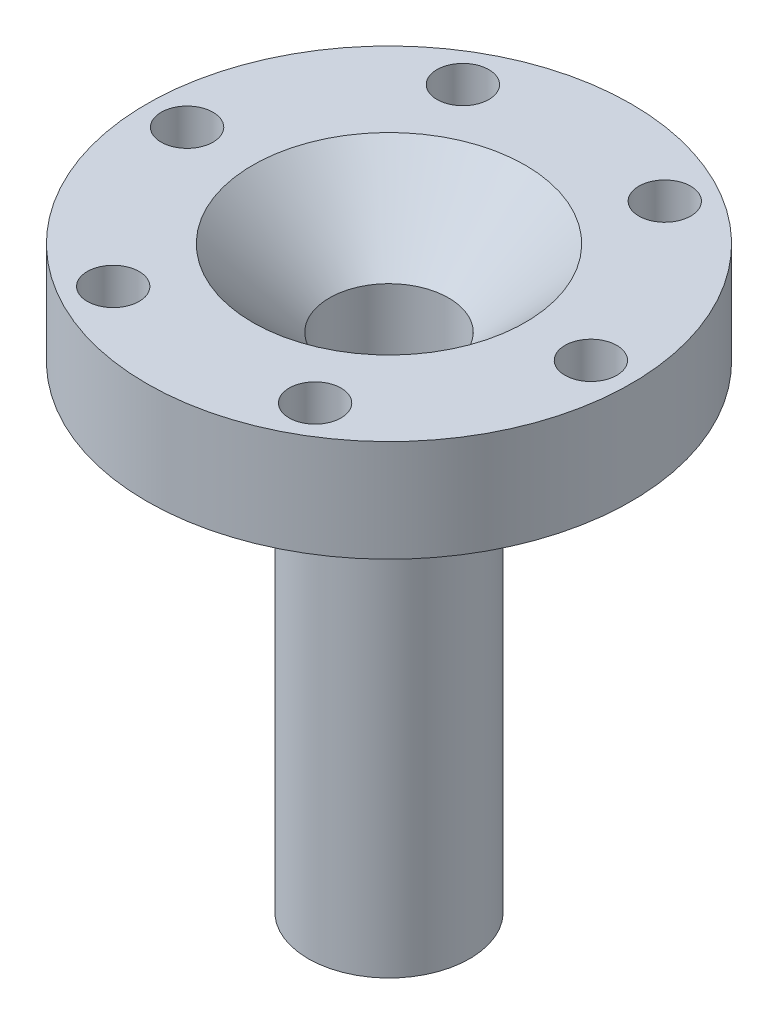
ISO-10303-21;
HEADER;
FILE_DESCRIPTION(('STEP AP214'),'2;1');
FILE_NAME('part.step','',(''),(''),'','','');
FILE_SCHEMA(('AUTOMOTIVE_DESIGN { 1 0 10303 214 1 1 1 1 }'));
ENDSEC;
DATA;
#1=APPLICATION_CONTEXT('core data for automotive mechanical design processes');
#2=APPLICATION_PROTOCOL_DEFINITION('international standard','automotive_design',2000,#1);
#3=PRODUCT_CONTEXT('',#1,'mechanical');
#4=PRODUCT('Part','Part','',(#3));
#5=PRODUCT_RELATED_PRODUCT_CATEGORY('part','',(#4));
#6=PRODUCT_DEFINITION_FORMATION('','',#4);
#7=PRODUCT_DEFINITION_CONTEXT('part definition',#1,'design');
#8=PRODUCT_DEFINITION('design','',#6,#7);
#9=PRODUCT_DEFINITION_SHAPE('','',#8);
#10=(LENGTH_UNIT() NAMED_UNIT(*) SI_UNIT(.MILLI.,.METRE.));
#11=(NAMED_UNIT(*) PLANE_ANGLE_UNIT() SI_UNIT($,.RADIAN.));
#12=(NAMED_UNIT(*) SI_UNIT($,.STERADIAN.) SOLID_ANGLE_UNIT());
#13=UNCERTAINTY_MEASURE_WITH_UNIT(LENGTH_MEASURE(1.E-05),#10,'distance_accuracy_value','');
#14=(GEOMETRIC_REPRESENTATION_CONTEXT(3) GLOBAL_UNCERTAINTY_ASSIGNED_CONTEXT((#13)) GLOBAL_UNIT_ASSIGNED_CONTEXT((#10,
#11,#12)) REPRESENTATION_CONTEXT('',''));
#15=CARTESIAN_POINT('',(0.,0.,0.));
#16=DIRECTION('',(0.,0.,1.));
#17=DIRECTION('',(1.,0.,0.));
#18=AXIS2_PLACEMENT_3D('',#15,#16,#17);
#19=CARTESIAN_POINT('',(10.16,-72.8200000000001,0.));
#20=DIRECTION('',(0.,1.,0.));
#21=DIRECTION('',(0.,0.,1.));
#22=AXIS2_PLACEMENT_3D('',#19,#20,#21);
#23=PLANE('',#22);
#24=CARTESIAN_POINT('',(0.,-72.8200000000001,0.));
#25=DIRECTION('',(0.,1.,0.));
#26=DIRECTION('',(0.,0.,1.));
#27=AXIS2_PLACEMENT_3D('',#24,#25,#26);
#28=CIRCLE('',#27,10.16);
#29=CARTESIAN_POINT('',(0.,-72.8200000000001,10.16));
#30=VERTEX_POINT('',#29);
#31=EDGE_CURVE('E49',#30,#30,#28,.T.);
#32=ORIENTED_EDGE('',*,*,#31,.F.);
#33=EDGE_LOOP('',(#32));
#34=FACE_BOUND('',#33,.T.);
#35=CARTESIAN_POINT('',(0.,-72.8200000000001,0.));
#36=DIRECTION('',(0.,1.,0.));
#37=DIRECTION('',(0.,0.,1.));
#38=AXIS2_PLACEMENT_3D('',#35,#36,#37);
#39=CIRCLE('',#38,7.50000000000001);
#40=CARTESIAN_POINT('',(0.,-72.8200000000001,7.50000000000001));
#41=VERTEX_POINT('',#40);
#42=EDGE_CURVE('E10',#41,#41,#39,.T.);
#43=ORIENTED_EDGE('',*,*,#42,.T.);
#44=EDGE_LOOP('',(#43));
#45=FACE_BOUND('',#44,.T.);
#46=ADVANCED_FACE('F32',(#34,#45),#23,.F.);
#47=CARTESIAN_POINT('',(0.,0.,0.));
#48=DIRECTION('',(0.,1.,0.));
#49=DIRECTION('',(0.,0.,1.));
#50=AXIS2_PLACEMENT_3D('',#47,#48,#49);
#51=CYLINDRICAL_SURFACE('',#50,7.50000000000001);
#52=ORIENTED_EDGE('',*,*,#42,.F.);
#53=EDGE_LOOP('',(#52));
#54=FACE_BOUND('',#53,.T.);
#55=CARTESIAN_POINT('',(0.,-9.6450000000001,0.));
#56=DIRECTION('',(0.,1.,0.));
#57=DIRECTION('',(0.,0.,1.));
#58=AXIS2_PLACEMENT_3D('',#55,#56,#57);
#59=CIRCLE('',#58,7.50000000000001);
#60=CARTESIAN_POINT('',(0.,-9.6450000000001,7.50000000000001));
#61=VERTEX_POINT('',#60);
#62=EDGE_CURVE('E39',#61,#61,#59,.T.);
#63=ORIENTED_EDGE('',*,*,#62,.T.);
#64=EDGE_LOOP('',(#63));
#65=FACE_BOUND('',#64,.T.);
#66=ADVANCED_FACE('F106',(#54,#65),#51,.F.);
#67=CARTESIAN_POINT('',(0.,0.,0.));
#68=DIRECTION('',(0.,1.,0.));
#69=DIRECTION('',(0.,0.,1.));
#70=AXIS2_PLACEMENT_3D('',#67,#68,#69);
#71=CONICAL_SURFACE('',#70,17.145,0.785398163397443);
#72=ORIENTED_EDGE('',*,*,#62,.F.);
#73=EDGE_LOOP('',(#72));
#74=FACE_BOUND('',#73,.T.);
#75=CARTESIAN_POINT('',(0.,0.,0.));
#76=DIRECTION('',(0.,1.,0.));
#77=DIRECTION('',(0.,0.,1.));
#78=AXIS2_PLACEMENT_3D('',#75,#76,#77);
#79=CIRCLE('',#78,17.145);
#80=CARTESIAN_POINT('',(0.,0.,17.145));
#81=VERTEX_POINT('',#80);
#82=EDGE_CURVE('E44',#81,#81,#79,.T.);
#83=ORIENTED_EDGE('',*,*,#82,.T.);
#84=EDGE_LOOP('',(#83));
#85=FACE_BOUND('',#84,.T.);
#86=ADVANCED_FACE('F76',(#74,#85),#71,.F.);
#87=CARTESIAN_POINT('',(17.145,0.,0.));
#88=DIRECTION('',(0.,-1.,0.));
#89=DIRECTION('',(0.,0.,-1.));
#90=AXIS2_PLACEMENT_3D('',#87,#88,#89);
#91=PLANE('',#90);
#92=CARTESIAN_POINT('',(12.7000000000003,0.,-21.9970452561246));
#93=DIRECTION('',(0.,1.,0.));
#94=DIRECTION('',(0.,0.,1.));
#95=AXIS2_PLACEMENT_3D('',#92,#93,#94);
#96=CIRCLE('',#95,3.26389999999999);
#97=CARTESIAN_POINT('',(12.7000000000003,0.,-18.7331452561246));
#98=VERTEX_POINT('',#97);
#99=EDGE_CURVE('E144',#98,#98,#96,.T.);
#100=ORIENTED_EDGE('',*,*,#99,.F.);
#101=EDGE_LOOP('',(#100));
#102=FACE_BOUND('',#101,.T.);
#103=CARTESIAN_POINT('',(-12.6999999999998,0.,-21.9970452561249));
#104=DIRECTION('',(0.,1.,0.));
#105=DIRECTION('',(0.,0.,1.));
#106=AXIS2_PLACEMENT_3D('',#103,#104,#105);
#107=CIRCLE('',#106,3.26389999999999);
#108=CARTESIAN_POINT('',(-12.6999999999998,0.,-18.7331452561249));
#109=VERTEX_POINT('',#108);
#110=EDGE_CURVE('E147',#109,#109,#107,.T.);
#111=ORIENTED_EDGE('',*,*,#110,.F.);
#112=EDGE_LOOP('',(#111));
#113=FACE_BOUND('',#112,.T.);
#114=CARTESIAN_POINT('',(-25.4,0.,0.));
#115=DIRECTION('',(0.,1.,0.));
#116=DIRECTION('',(0.,0.,1.));
#117=AXIS2_PLACEMENT_3D('',#114,#115,#116);
#118=CIRCLE('',#117,3.26389999999999);
#119=CARTESIAN_POINT('',(-25.4,0.,3.26389999999999));
#120=VERTEX_POINT('',#119);
#121=EDGE_CURVE('E155',#120,#120,#118,.T.);
#122=ORIENTED_EDGE('',*,*,#121,.F.);
#123=EDGE_LOOP('',(#122));
#124=FACE_BOUND('',#123,.T.);
#125=CARTESIAN_POINT('',(-12.7000000000001,0.,21.9970452561247));
#126=DIRECTION('',(0.,1.,0.));
#127=DIRECTION('',(0.,0.,1.));
#128=AXIS2_PLACEMENT_3D('',#125,#126,#127);
#129=CIRCLE('',#128,3.26389999999999);
#130=CARTESIAN_POINT('',(-12.7000000000001,0.,25.2609452561247));
#131=VERTEX_POINT('',#130);
#132=EDGE_CURVE('E161',#131,#131,#129,.T.);
#133=ORIENTED_EDGE('',*,*,#132,.F.);
#134=EDGE_LOOP('',(#133));
#135=FACE_BOUND('',#134,.T.);
#136=CARTESIAN_POINT('',(12.6999999999999,0.,21.9970452561248));
#137=DIRECTION('',(0.,1.,0.));
#138=DIRECTION('',(0.,0.,1.));
#139=AXIS2_PLACEMENT_3D('',#136,#137,#138);
#140=CIRCLE('',#139,3.26389999999999);
#141=CARTESIAN_POINT('',(12.6999999999999,0.,25.2609452561248));
#142=VERTEX_POINT('',#141);
#143=EDGE_CURVE('E62',#142,#142,#140,.T.);
#144=ORIENTED_EDGE('',*,*,#143,.F.);
#145=EDGE_LOOP('',(#144));
#146=FACE_BOUND('',#145,.T.);
#147=CARTESIAN_POINT('',(25.4,0.,0.));
#148=DIRECTION('',(0.,1.,0.));
#149=DIRECTION('',(0.,0.,1.));
#150=AXIS2_PLACEMENT_3D('',#147,#148,#149);
#151=CIRCLE('',#150,3.26389999999999);
#152=CARTESIAN_POINT('',(25.4,0.,3.26389999999999));
#153=VERTEX_POINT('',#152);
#154=EDGE_CURVE('E50',#153,#153,#151,.T.);
#155=ORIENTED_EDGE('',*,*,#154,.F.);
#156=EDGE_LOOP('',(#155));
#157=FACE_BOUND('',#156,.T.);
#158=ORIENTED_EDGE('',*,*,#82,.F.);
#159=EDGE_LOOP('',(#158));
#160=FACE_BOUND('',#159,.T.);
#161=CARTESIAN_POINT('',(0.,0.,0.));
#162=DIRECTION('',(0.,1.,0.));
#163=DIRECTION('',(0.,0.,1.));
#164=AXIS2_PLACEMENT_3D('',#161,#162,#163);
#165=CIRCLE('',#164,30.48);
#166=CARTESIAN_POINT('',(0.,0.,30.48));
#167=VERTEX_POINT('',#166);
#168=EDGE_CURVE('E71',#167,#167,#165,.T.);
#169=ORIENTED_EDGE('',*,*,#168,.T.);
#170=EDGE_LOOP('',(#169));
#171=FACE_BOUND('',#170,.T.);
#172=ADVANCED_FACE('F78',(#102,#113,#124,#135,#146,#157,#160,#171),#91,.F.);
#173=CARTESIAN_POINT('',(0.,0.,0.));
#174=DIRECTION('',(0.,1.,0.));
#175=DIRECTION('',(0.,0.,1.));
#176=AXIS2_PLACEMENT_3D('',#173,#174,#175);
#177=CYLINDRICAL_SURFACE('',#176,30.48);
#178=ORIENTED_EDGE('',*,*,#168,.F.);
#179=EDGE_LOOP('',(#178));
#180=FACE_BOUND('',#179,.T.);
#181=CARTESIAN_POINT('',(0.,-12.8200000000001,0.));
#182=DIRECTION('',(0.,1.,0.));
#183=DIRECTION('',(0.,0.,1.));
#184=AXIS2_PLACEMENT_3D('',#181,#182,#183);
#185=CIRCLE('',#184,30.48);
#186=CARTESIAN_POINT('',(0.,-12.8200000000001,30.48));
#187=VERTEX_POINT('',#186);
#188=EDGE_CURVE('E68',#187,#187,#185,.T.);
#189=ORIENTED_EDGE('',*,*,#188,.T.);
#190=EDGE_LOOP('',(#189));
#191=FACE_BOUND('',#190,.T.);
#192=ADVANCED_FACE('F81',(#180,#191),#177,.T.);
#193=CARTESIAN_POINT('',(30.48,-12.8200000000001,0.));
#194=DIRECTION('',(0.,1.,0.));
#195=DIRECTION('',(0.,0.,1.));
#196=AXIS2_PLACEMENT_3D('',#193,#194,#195);
#197=PLANE('',#196);
#198=CARTESIAN_POINT('',(12.7000000000003,-12.8200000000001,-21.9970452561246));
#199=DIRECTION('',(0.,1.,0.));
#200=DIRECTION('',(0.,0.,1.));
#201=AXIS2_PLACEMENT_3D('',#198,#199,#200);
#202=CIRCLE('',#201,3.26389999999999);
#203=CARTESIAN_POINT('',(12.7000000000003,-12.8200000000001,-18.7331452561246));
#204=VERTEX_POINT('',#203);
#205=EDGE_CURVE('E35',#204,#204,#202,.T.);
#206=ORIENTED_EDGE('',*,*,#205,.T.);
#207=EDGE_LOOP('',(#206));
#208=FACE_BOUND('',#207,.T.);
#209=CARTESIAN_POINT('',(-12.6999999999998,-12.8200000000001,-21.9970452561249));
#210=DIRECTION('',(0.,1.,0.));
#211=DIRECTION('',(0.,0.,1.));
#212=AXIS2_PLACEMENT_3D('',#209,#210,#211);
#213=CIRCLE('',#212,3.26389999999999);
#214=CARTESIAN_POINT('',(-12.6999999999998,-12.8200000000001,-18.7331452561249));
#215=VERTEX_POINT('',#214);
#216=EDGE_CURVE('E149',#215,#215,#213,.T.);
#217=ORIENTED_EDGE('',*,*,#216,.T.);
#218=EDGE_LOOP('',(#217));
#219=FACE_BOUND('',#218,.T.);
#220=CARTESIAN_POINT('',(-25.4,-12.8200000000001,0.));
#221=DIRECTION('',(0.,1.,0.));
#222=DIRECTION('',(0.,0.,1.));
#223=AXIS2_PLACEMENT_3D('',#220,#221,#222);
#224=CIRCLE('',#223,3.26389999999999);
#225=CARTESIAN_POINT('',(-25.4,-12.8200000000001,3.26389999999999));
#226=VERTEX_POINT('',#225);
#227=EDGE_CURVE('E158',#226,#226,#224,.T.);
#228=ORIENTED_EDGE('',*,*,#227,.T.);
#229=EDGE_LOOP('',(#228));
#230=FACE_BOUND('',#229,.T.);
#231=CARTESIAN_POINT('',(-12.7000000000001,-12.8200000000001,21.9970452561247));
#232=DIRECTION('',(0.,1.,0.));
#233=DIRECTION('',(0.,0.,1.));
#234=AXIS2_PLACEMENT_3D('',#231,#232,#233);
#235=CIRCLE('',#234,3.26389999999999);
#236=CARTESIAN_POINT('',(-12.7000000000001,-12.8200000000001,25.2609452561247));
#237=VERTEX_POINT('',#236);
#238=EDGE_CURVE('E164',#237,#237,#235,.T.);
#239=ORIENTED_EDGE('',*,*,#238,.T.);
#240=EDGE_LOOP('',(#239));
#241=FACE_BOUND('',#240,.T.);
#242=CARTESIAN_POINT('',(12.6999999999999,-12.8200000000001,21.9970452561248));
#243=DIRECTION('',(0.,1.,0.));
#244=DIRECTION('',(0.,0.,1.));
#245=AXIS2_PLACEMENT_3D('',#242,#243,#244);
#246=CIRCLE('',#245,3.26389999999999);
#247=CARTESIAN_POINT('',(12.6999999999999,-12.8200000000001,25.2609452561248));
#248=VERTEX_POINT('',#247);
#249=EDGE_CURVE('E57',#248,#248,#246,.T.);
#250=ORIENTED_EDGE('',*,*,#249,.T.);
#251=EDGE_LOOP('',(#250));
#252=FACE_BOUND('',#251,.T.);
#253=CARTESIAN_POINT('',(25.4,-12.8200000000001,0.));
#254=DIRECTION('',(0.,1.,0.));
#255=DIRECTION('',(0.,0.,1.));
#256=AXIS2_PLACEMENT_3D('',#253,#254,#255);
#257=CIRCLE('',#256,3.26389999999999);
#258=CARTESIAN_POINT('',(25.4,-12.8200000000001,3.26389999999999));
#259=VERTEX_POINT('',#258);
#260=EDGE_CURVE('E47',#259,#259,#257,.T.);
#261=ORIENTED_EDGE('',*,*,#260,.T.);
#262=EDGE_LOOP('',(#261));
#263=FACE_BOUND('',#262,.T.);
#264=ORIENTED_EDGE('',*,*,#188,.F.);
#265=EDGE_LOOP('',(#264));
#266=FACE_BOUND('',#265,.T.);
#267=CARTESIAN_POINT('',(0.,-12.8200000000001,0.));
#268=DIRECTION('',(0.,1.,0.));
#269=DIRECTION('',(0.,0.,1.));
#270=AXIS2_PLACEMENT_3D('',#267,#268,#269);
#271=CIRCLE('',#270,10.16);
#272=CARTESIAN_POINT('',(0.,-12.8200000000001,10.16));
#273=VERTEX_POINT('',#272);
#274=EDGE_CURVE('E54',#273,#273,#271,.T.);
#275=ORIENTED_EDGE('',*,*,#274,.T.);
#276=EDGE_LOOP('',(#275));
#277=FACE_BOUND('',#276,.T.);
#278=ADVANCED_FACE('F88',(#208,#219,#230,#241,#252,#263,#266,#277),#197,.F.);
#279=CARTESIAN_POINT('',(0.,0.,0.));
#280=DIRECTION('',(0.,1.,0.));
#281=DIRECTION('',(0.,0.,1.));
#282=AXIS2_PLACEMENT_3D('',#279,#280,#281);
#283=CYLINDRICAL_SURFACE('',#282,10.16);
#284=ORIENTED_EDGE('',*,*,#274,.F.);
#285=EDGE_LOOP('',(#284));
#286=FACE_BOUND('',#285,.T.);
#287=ORIENTED_EDGE('',*,*,#31,.T.);
#288=EDGE_LOOP('',(#287));
#289=FACE_BOUND('',#288,.T.);
#290=ADVANCED_FACE('F94',(#286,#289),#283,.T.);
#291=CARTESIAN_POINT('',(25.4,0.,0.));
#292=DIRECTION('',(0.,1.,0.));
#293=DIRECTION('',(0.,0.,1.));
#294=AXIS2_PLACEMENT_3D('',#291,#292,#293);
#295=CYLINDRICAL_SURFACE('',#294,3.26389999999999);
#296=ORIENTED_EDGE('',*,*,#154,.T.);
#297=EDGE_LOOP('',(#296));
#298=FACE_BOUND('',#297,.T.);
#299=ORIENTED_EDGE('',*,*,#260,.F.);
#300=EDGE_LOOP('',(#299));
#301=FACE_BOUND('',#300,.T.);
#302=ADVANCED_FACE('F101',(#298,#301),#295,.F.);
#303=CARTESIAN_POINT('',(12.6999999999999,0.,21.9970452561248));
#304=DIRECTION('',(0.,1.,0.));
#305=DIRECTION('',(0.,0.,1.));
#306=AXIS2_PLACEMENT_3D('',#303,#304,#305);
#307=CYLINDRICAL_SURFACE('',#306,3.26389999999999);
#308=ORIENTED_EDGE('',*,*,#143,.T.);
#309=EDGE_LOOP('',(#308));
#310=FACE_BOUND('',#309,.T.);
#311=ORIENTED_EDGE('',*,*,#249,.F.);
#312=EDGE_LOOP('',(#311));
#313=FACE_BOUND('',#312,.T.);
#314=ADVANCED_FACE('F120',(#310,#313),#307,.F.);
#315=CARTESIAN_POINT('',(-12.7000000000001,0.,21.9970452561247));
#316=DIRECTION('',(0.,1.,0.));
#317=DIRECTION('',(0.,0.,1.));
#318=AXIS2_PLACEMENT_3D('',#315,#316,#317);
#319=CYLINDRICAL_SURFACE('',#318,3.26389999999999);
#320=ORIENTED_EDGE('',*,*,#132,.T.);
#321=EDGE_LOOP('',(#320));
#322=FACE_BOUND('',#321,.T.);
#323=ORIENTED_EDGE('',*,*,#238,.F.);
#324=EDGE_LOOP('',(#323));
#325=FACE_BOUND('',#324,.T.);
#326=ADVANCED_FACE('F123',(#322,#325),#319,.F.);
#327=CARTESIAN_POINT('',(-25.4,0.,0.));
#328=DIRECTION('',(0.,1.,0.));
#329=DIRECTION('',(0.,0.,1.));
#330=AXIS2_PLACEMENT_3D('',#327,#328,#329);
#331=CYLINDRICAL_SURFACE('',#330,3.26389999999999);
#332=ORIENTED_EDGE('',*,*,#121,.T.);
#333=EDGE_LOOP('',(#332));
#334=FACE_BOUND('',#333,.T.);
#335=ORIENTED_EDGE('',*,*,#227,.F.);
#336=EDGE_LOOP('',(#335));
#337=FACE_BOUND('',#336,.T.);
#338=ADVANCED_FACE('F127',(#334,#337),#331,.F.);
#339=CARTESIAN_POINT('',(-12.6999999999998,0.,-21.9970452561249));
#340=DIRECTION('',(0.,1.,0.));
#341=DIRECTION('',(0.,0.,1.));
#342=AXIS2_PLACEMENT_3D('',#339,#340,#341);
#343=CYLINDRICAL_SURFACE('',#342,3.26389999999999);
#344=ORIENTED_EDGE('',*,*,#110,.T.);
#345=EDGE_LOOP('',(#344));
#346=FACE_BOUND('',#345,.T.);
#347=ORIENTED_EDGE('',*,*,#216,.F.);
#348=EDGE_LOOP('',(#347));
#349=FACE_BOUND('',#348,.T.);
#350=ADVANCED_FACE('F131',(#346,#349),#343,.F.);
#351=CARTESIAN_POINT('',(12.7000000000003,0.,-21.9970452561246));
#352=DIRECTION('',(0.,1.,0.));
#353=DIRECTION('',(0.,0.,1.));
#354=AXIS2_PLACEMENT_3D('',#351,#352,#353);
#355=CYLINDRICAL_SURFACE('',#354,3.26389999999999);
#356=ORIENTED_EDGE('',*,*,#99,.T.);
#357=EDGE_LOOP('',(#356));
#358=FACE_BOUND('',#357,.T.);
#359=ORIENTED_EDGE('',*,*,#205,.F.);
#360=EDGE_LOOP('',(#359));
#361=FACE_BOUND('',#360,.T.);
#362=ADVANCED_FACE('F135',(#358,#361),#355,.F.);
#363=CLOSED_SHELL('',(#46,#66,#86,#172,#192,#278,#290,#302,#314,#326,#338,#350,#362));
#364=MANIFOLD_SOLID_BREP('B2',#363);
#365=ADVANCED_BREP_SHAPE_REPRESENTATION('',(#18,#364),#14);
#366=SHAPE_DEFINITION_REPRESENTATION(#9,#365);
ENDSEC;
END-ISO-10303-21;
